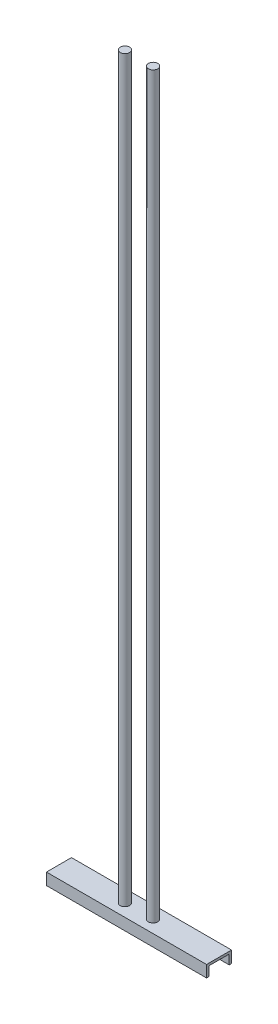
ISO-10303-21;
HEADER;
FILE_DESCRIPTION(('STEP AP214'),'2;1');
FILE_NAME('part.step','',(''),(''),'','','');
FILE_SCHEMA(('AUTOMOTIVE_DESIGN { 1 0 10303 214 1 1 1 1 }'));
ENDSEC;
DATA;
#1=APPLICATION_CONTEXT('core data for automotive mechanical design processes');
#2=APPLICATION_PROTOCOL_DEFINITION('international standard','automotive_design',2000,#1);
#3=PRODUCT_CONTEXT('',#1,'mechanical');
#4=PRODUCT('Part','Part','',(#3));
#5=PRODUCT_RELATED_PRODUCT_CATEGORY('part','',(#4));
#6=PRODUCT_DEFINITION_FORMATION('','',#4);
#7=PRODUCT_DEFINITION_CONTEXT('part definition',#1,'design');
#8=PRODUCT_DEFINITION('design','',#6,#7);
#9=PRODUCT_DEFINITION_SHAPE('','',#8);
#10=(LENGTH_UNIT() NAMED_UNIT(*) SI_UNIT(.MILLI.,.METRE.));
#11=(NAMED_UNIT(*) PLANE_ANGLE_UNIT() SI_UNIT($,.RADIAN.));
#12=(NAMED_UNIT(*) SI_UNIT($,.STERADIAN.) SOLID_ANGLE_UNIT());
#13=UNCERTAINTY_MEASURE_WITH_UNIT(LENGTH_MEASURE(1.E-05),#10,'distance_accuracy_value','');
#14=(GEOMETRIC_REPRESENTATION_CONTEXT(3) GLOBAL_UNCERTAINTY_ASSIGNED_CONTEXT((#13)) GLOBAL_UNIT_ASSIGNED_CONTEXT((#10,
#11,#12)) REPRESENTATION_CONTEXT('',''));
#15=CARTESIAN_POINT('',(0.,0.,0.));
#16=DIRECTION('',(0.,0.,1.));
#17=DIRECTION('',(1.,0.,0.));
#18=AXIS2_PLACEMENT_3D('',#15,#16,#17);
#19=CARTESIAN_POINT('',(0.,-9.525,0.));
#20=DIRECTION('',(0.,-1.,0.));
#21=DIRECTION('',(0.,0.,-1.));
#22=AXIS2_PLACEMENT_3D('',#19,#20,#21);
#23=PLANE('',#22);
#24=DIRECTION('',(0.,0.,1.));
#25=VECTOR('',#24,1.);
#26=CARTESIAN_POINT('',(-325.,-9.525,50.8));
#27=LINE('',#26,#25);
#28=CARTESIAN_POINT('',(-325.,-9.525,-36.2750000000001));
#29=VERTEX_POINT('',#28);
#30=CARTESIAN_POINT('',(-325.,-9.525,36.275));
#31=VERTEX_POINT('',#30);
#32=EDGE_CURVE('E163',#29,#31,#27,.T.);
#33=ORIENTED_EDGE('',*,*,#32,.F.);
#34=DIRECTION('',(-1.,0.,0.));
#35=VECTOR('',#34,1.);
#36=CARTESIAN_POINT('',(0.,-9.525,-36.275));
#37=LINE('',#36,#35);
#38=CARTESIAN_POINT('',(325.,-9.525,-36.275));
#39=VERTEX_POINT('',#38);
#40=EDGE_CURVE('E188',#29,#39,#37,.F.);
#41=ORIENTED_EDGE('',*,*,#40,.T.);
#42=DIRECTION('',(0.,0.,-1.));
#43=VECTOR('',#42,1.);
#44=CARTESIAN_POINT('',(325.,-9.525,50.8));
#45=LINE('',#44,#43);
#46=CARTESIAN_POINT('',(325.,-9.525,36.275));
#47=VERTEX_POINT('',#46);
#48=EDGE_CURVE('E161',#47,#39,#45,.T.);
#49=ORIENTED_EDGE('',*,*,#48,.F.);
#50=DIRECTION('',(1.,0.,0.));
#51=VECTOR('',#50,1.);
#52=CARTESIAN_POINT('',(0.,-9.525,36.275));
#53=LINE('',#52,#51);
#54=EDGE_CURVE('E186',#47,#31,#53,.F.);
#55=ORIENTED_EDGE('',*,*,#54,.T.);
#56=EDGE_LOOP('',(#33,#41,#49,#55));
#57=FACE_BOUND('',#56,.T.);
#58=ADVANCED_FACE('F32',(#57),#23,.T.);
#59=CARTESIAN_POINT('',(325.,-9.525,50.8));
#60=DIRECTION('',(1.,0.,0.));
#61=DIRECTION('',(0.,0.,-1.));
#62=AXIS2_PLACEMENT_3D('',#59,#60,#61);
#63=PLANE('',#62);
#64=DIRECTION('',(0.,0.,-1.));
#65=VECTOR('',#64,1.);
#66=CARTESIAN_POINT('',(325.,0.,50.8));
#67=LINE('',#66,#65);
#68=CARTESIAN_POINT('',(325.,0.,50.8));
#69=VERTEX_POINT('',#68);
#70=CARTESIAN_POINT('',(325.,0.,-50.8));
#71=VERTEX_POINT('',#70);
#72=EDGE_CURVE('E160',#69,#71,#67,.T.);
#73=ORIENTED_EDGE('',*,*,#72,.F.);
#74=DIRECTION('',(0.,1.,0.));
#75=VECTOR('',#74,1.);
#76=CARTESIAN_POINT('',(325.,-9.525,50.8));
#77=LINE('',#76,#75);
#78=CARTESIAN_POINT('',(325.,-47.625,50.8));
#79=VERTEX_POINT('',#78);
#80=EDGE_CURVE('E177',#79,#69,#77,.T.);
#81=ORIENTED_EDGE('',*,*,#80,.F.);
#82=DIRECTION('',(0.,0.,1.));
#83=VECTOR('',#82,1.);
#84=CARTESIAN_POINT('',(325.,-47.625,50.8));
#85=LINE('',#84,#83);
#86=CARTESIAN_POINT('',(325.,-47.625,41.275));
#87=VERTEX_POINT('',#86);
#88=EDGE_CURVE('E149',#87,#79,#85,.T.);
#89=ORIENTED_EDGE('',*,*,#88,.F.);
#90=DIRECTION('',(0.,1.,0.));
#91=VECTOR('',#90,1.);
#92=CARTESIAN_POINT('',(325.,-47.625,41.275));
#93=LINE('',#92,#91);
#94=CARTESIAN_POINT('',(325.,-14.525,41.275));
#95=VERTEX_POINT('',#94);
#96=EDGE_CURVE('E155',#87,#95,#93,.T.);
#97=ORIENTED_EDGE('',*,*,#96,.T.);
#98=CARTESIAN_POINT('',(325.,-14.525,36.275));
#99=DIRECTION('',(1.,0.,0.));
#100=DIRECTION('',(0.,0.,-1.));
#101=AXIS2_PLACEMENT_3D('',#98,#99,#100);
#102=CIRCLE('',#101,5.);
#103=EDGE_CURVE('E55',#95,#47,#102,.F.);
#104=ORIENTED_EDGE('',*,*,#103,.T.);
#105=ORIENTED_EDGE('',*,*,#48,.T.);
#106=CARTESIAN_POINT('',(325.,-14.525,-36.275));
#107=DIRECTION('',(1.,0.,0.));
#108=DIRECTION('',(0.,0.,-1.));
#109=AXIS2_PLACEMENT_3D('',#106,#107,#108);
#110=CIRCLE('',#109,5.);
#111=CARTESIAN_POINT('',(325.,-14.525,-41.275));
#112=VERTEX_POINT('',#111);
#113=EDGE_CURVE('E139',#39,#112,#110,.F.);
#114=ORIENTED_EDGE('',*,*,#113,.T.);
#115=DIRECTION('',(0.,1.,0.));
#116=VECTOR('',#115,1.);
#117=CARTESIAN_POINT('',(325.,-47.625,-41.275));
#118=LINE('',#117,#116);
#119=CARTESIAN_POINT('',(325.,-47.625,-41.275));
#120=VERTEX_POINT('',#119);
#121=EDGE_CURVE('E117',#120,#112,#118,.T.);
#122=ORIENTED_EDGE('',*,*,#121,.F.);
#123=DIRECTION('',(0.,0.,1.));
#124=VECTOR('',#123,1.);
#125=CARTESIAN_POINT('',(325.,-47.625,-50.8));
#126=LINE('',#125,#124);
#127=CARTESIAN_POINT('',(325.,-47.625,-50.8));
#128=VERTEX_POINT('',#127);
#129=EDGE_CURVE('E125',#128,#120,#126,.T.);
#130=ORIENTED_EDGE('',*,*,#129,.F.);
#131=DIRECTION('',(0.,1.,0.));
#132=VECTOR('',#131,1.);
#133=CARTESIAN_POINT('',(325.,-9.525,-50.8));
#134=LINE('',#133,#132);
#135=EDGE_CURVE('E166',#128,#71,#134,.T.);
#136=ORIENTED_EDGE('',*,*,#135,.T.);
#137=EDGE_LOOP('',(#73,#81,#89,#97,#104,#105,#114,#122,#130,#136));
#138=FACE_BOUND('',#137,.T.);
#139=ADVANCED_FACE('F136',(#138),#63,.T.);
#140=CARTESIAN_POINT('',(-325.,-9.525,50.8));
#141=DIRECTION('',(0.,0.,1.));
#142=DIRECTION('',(1.,0.,0.));
#143=AXIS2_PLACEMENT_3D('',#140,#141,#142);
#144=PLANE('',#143);
#145=DIRECTION('',(1.,0.,0.));
#146=VECTOR('',#145,1.);
#147=CARTESIAN_POINT('',(-325.,0.,50.8));
#148=LINE('',#147,#146);
#149=CARTESIAN_POINT('',(-325.,0.,50.8));
#150=VERTEX_POINT('',#149);
#151=EDGE_CURVE('E164',#150,#69,#148,.T.);
#152=ORIENTED_EDGE('',*,*,#151,.F.);
#153=DIRECTION('',(0.,1.,0.));
#154=VECTOR('',#153,1.);
#155=CARTESIAN_POINT('',(-325.,-9.525,50.8));
#156=LINE('',#155,#154);
#157=CARTESIAN_POINT('',(-325.,-47.625,50.8));
#158=VERTEX_POINT('',#157);
#159=EDGE_CURVE('E180',#158,#150,#156,.T.);
#160=ORIENTED_EDGE('',*,*,#159,.F.);
#161=DIRECTION('',(-1.,0.,0.));
#162=VECTOR('',#161,1.);
#163=CARTESIAN_POINT('',(-325.,-47.625,50.8));
#164=LINE('',#163,#162);
#165=EDGE_CURVE('E152',#79,#158,#164,.T.);
#166=ORIENTED_EDGE('',*,*,#165,.F.);
#167=ORIENTED_EDGE('',*,*,#80,.T.);
#168=EDGE_LOOP('',(#152,#160,#166,#167));
#169=FACE_BOUND('',#168,.T.);
#170=ADVANCED_FACE('F216',(#169),#144,.T.);
#171=CARTESIAN_POINT('',(-325.,-9.525,50.8));
#172=DIRECTION('',(-1.,0.,0.));
#173=DIRECTION('',(0.,0.,1.));
#174=AXIS2_PLACEMENT_3D('',#171,#172,#173);
#175=PLANE('',#174);
#176=DIRECTION('',(0.,0.,1.));
#177=VECTOR('',#176,1.);
#178=CARTESIAN_POINT('',(-325.,0.,50.8));
#179=LINE('',#178,#177);
#180=CARTESIAN_POINT('',(-325.,0.,-50.8));
#181=VERTEX_POINT('',#180);
#182=EDGE_CURVE('E172',#181,#150,#179,.T.);
#183=ORIENTED_EDGE('',*,*,#182,.F.);
#184=DIRECTION('',(0.,1.,0.));
#185=VECTOR('',#184,1.);
#186=CARTESIAN_POINT('',(-325.,-9.525,-50.8));
#187=LINE('',#186,#185);
#188=CARTESIAN_POINT('',(-325.,-47.625,-50.8000000000001));
#189=VERTEX_POINT('',#188);
#190=EDGE_CURVE('E182',#189,#181,#187,.T.);
#191=ORIENTED_EDGE('',*,*,#190,.F.);
#192=DIRECTION('',(0.,0.,-1.));
#193=VECTOR('',#192,1.);
#194=CARTESIAN_POINT('',(-325.,-47.625,-50.8000000000001));
#195=LINE('',#194,#193);
#196=CARTESIAN_POINT('',(-325.,-47.625,-41.2750000000001));
#197=VERTEX_POINT('',#196);
#198=EDGE_CURVE('E124',#197,#189,#195,.T.);
#199=ORIENTED_EDGE('',*,*,#198,.F.);
#200=DIRECTION('',(0.,1.,0.));
#201=VECTOR('',#200,1.);
#202=CARTESIAN_POINT('',(-325.,-47.625,-41.2750000000001));
#203=LINE('',#202,#201);
#204=CARTESIAN_POINT('',(-325.,-14.525,-41.2750000000001));
#205=VERTEX_POINT('',#204);
#206=EDGE_CURVE('E120',#197,#205,#203,.T.);
#207=ORIENTED_EDGE('',*,*,#206,.T.);
#208=CARTESIAN_POINT('',(-325.,-14.525,-36.2750000000001));
#209=DIRECTION('',(-1.,0.,0.));
#210=DIRECTION('',(0.,0.,1.));
#211=AXIS2_PLACEMENT_3D('',#208,#209,#210);
#212=CIRCLE('',#211,5.);
#213=EDGE_CURVE('E192',#205,#29,#212,.F.);
#214=ORIENTED_EDGE('',*,*,#213,.T.);
#215=ORIENTED_EDGE('',*,*,#32,.T.);
#216=CARTESIAN_POINT('',(-325.,-14.525,36.275));
#217=DIRECTION('',(-1.,0.,0.));
#218=DIRECTION('',(0.,0.,1.));
#219=AXIS2_PLACEMENT_3D('',#216,#217,#218);
#220=CIRCLE('',#219,5.);
#221=CARTESIAN_POINT('',(-325.,-14.525,41.275));
#222=VERTEX_POINT('',#221);
#223=EDGE_CURVE('E47',#31,#222,#220,.F.);
#224=ORIENTED_EDGE('',*,*,#223,.T.);
#225=DIRECTION('',(0.,1.,0.));
#226=VECTOR('',#225,1.);
#227=CARTESIAN_POINT('',(-325.,-47.625,41.275));
#228=LINE('',#227,#226);
#229=CARTESIAN_POINT('',(-325.,-47.625,41.275));
#230=VERTEX_POINT('',#229);
#231=EDGE_CURVE('E158',#230,#222,#228,.T.);
#232=ORIENTED_EDGE('',*,*,#231,.F.);
#233=DIRECTION('',(0.,0.,-1.));
#234=VECTOR('',#233,1.);
#235=CARTESIAN_POINT('',(-325.,-47.625,50.8));
#236=LINE('',#235,#234);
#237=EDGE_CURVE('E140',#158,#230,#236,.T.);
#238=ORIENTED_EDGE('',*,*,#237,.F.);
#239=ORIENTED_EDGE('',*,*,#159,.T.);
#240=EDGE_LOOP('',(#183,#191,#199,#207,#214,#215,#224,#232,#238,#239));
#241=FACE_BOUND('',#240,.T.);
#242=ADVANCED_FACE('F213',(#241),#175,.T.);
#243=CARTESIAN_POINT('',(-325.,-9.525,-50.8));
#244=DIRECTION('',(0.,0.,-1.));
#245=DIRECTION('',(-1.,0.,0.));
#246=AXIS2_PLACEMENT_3D('',#243,#244,#245);
#247=PLANE('',#246);
#248=DIRECTION('',(-1.,0.,0.));
#249=VECTOR('',#248,1.);
#250=CARTESIAN_POINT('',(-325.,0.,-50.8));
#251=LINE('',#250,#249);
#252=EDGE_CURVE('E169',#71,#181,#251,.T.);
#253=ORIENTED_EDGE('',*,*,#252,.F.);
#254=ORIENTED_EDGE('',*,*,#135,.F.);
#255=DIRECTION('',(1.,0.,0.));
#256=VECTOR('',#255,1.);
#257=CARTESIAN_POINT('',(325.,-47.625,-50.8));
#258=LINE('',#257,#256);
#259=EDGE_CURVE('E131',#189,#128,#258,.T.);
#260=ORIENTED_EDGE('',*,*,#259,.F.);
#261=ORIENTED_EDGE('',*,*,#190,.T.);
#262=EDGE_LOOP('',(#253,#254,#260,#261));
#263=FACE_BOUND('',#262,.T.);
#264=ADVANCED_FACE('F205',(#263),#247,.T.);
#265=CARTESIAN_POINT('',(0.,0.,0.));
#266=DIRECTION('',(0.,-1.,0.));
#267=DIRECTION('',(0.,0.,-1.));
#268=AXIS2_PLACEMENT_3D('',#265,#266,#267);
#269=PLANE('',#268);
#270=CARTESIAN_POINT('',(57.15,0.,1.31898946727457E-13));
#271=DIRECTION('',(0.,-1.,0.));
#272=DIRECTION('',(0.,0.,-1.));
#273=AXIS2_PLACEMENT_3D('',#270,#271,#272);
#274=CIRCLE('',#273,19.05);
#275=CARTESIAN_POINT('',(57.15,0.,-19.0499999999999));
#276=VERTEX_POINT('',#275);
#277=EDGE_CURVE('E11',#276,#276,#274,.F.);
#278=ORIENTED_EDGE('',*,*,#277,.F.);
#279=EDGE_LOOP('',(#278));
#280=FACE_BOUND('',#279,.T.);
#281=CARTESIAN_POINT('',(-57.15,0.,0.));
#282=DIRECTION('',(0.,-1.,0.));
#283=DIRECTION('',(0.,0.,-1.));
#284=AXIS2_PLACEMENT_3D('',#281,#282,#283);
#285=CIRCLE('',#284,19.05);
#286=CARTESIAN_POINT('',(-57.15,0.,-19.05));
#287=VERTEX_POINT('',#286);
#288=EDGE_CURVE('E40',#287,#287,#285,.F.);
#289=ORIENTED_EDGE('',*,*,#288,.F.);
#290=EDGE_LOOP('',(#289));
#291=FACE_BOUND('',#290,.T.);
#292=ORIENTED_EDGE('',*,*,#72,.T.);
#293=ORIENTED_EDGE('',*,*,#252,.T.);
#294=ORIENTED_EDGE('',*,*,#182,.T.);
#295=ORIENTED_EDGE('',*,*,#151,.T.);
#296=EDGE_LOOP('',(#292,#293,#294,#295));
#297=FACE_BOUND('',#296,.T.);
#298=ADVANCED_FACE('F201',(#280,#291,#297),#269,.F.);
#299=CARTESIAN_POINT('',(-325.,-47.625,41.275));
#300=DIRECTION('',(0.,0.,1.));
#301=DIRECTION('',(1.,0.,0.));
#302=AXIS2_PLACEMENT_3D('',#299,#300,#301);
#303=PLANE('',#302);
#304=ORIENTED_EDGE('',*,*,#231,.T.);
#305=DIRECTION('',(1.,0.,0.));
#306=VECTOR('',#305,1.);
#307=CARTESIAN_POINT('',(-325.,-14.525,41.275));
#308=LINE('',#307,#306);
#309=EDGE_CURVE('E190',#222,#95,#308,.T.);
#310=ORIENTED_EDGE('',*,*,#309,.T.);
#311=ORIENTED_EDGE('',*,*,#96,.F.);
#312=DIRECTION('',(1.,0.,0.));
#313=VECTOR('',#312,1.);
#314=CARTESIAN_POINT('',(-325.,-47.625,41.275));
#315=LINE('',#314,#313);
#316=EDGE_CURVE('E143',#230,#87,#315,.T.);
#317=ORIENTED_EDGE('',*,*,#316,.F.);
#318=EDGE_LOOP('',(#304,#310,#311,#317));
#319=FACE_BOUND('',#318,.T.);
#320=ADVANCED_FACE('F204',(#319),#303,.F.);
#321=CARTESIAN_POINT('',(0.,-47.625,0.));
#322=DIRECTION('',(0.,-1.,0.));
#323=DIRECTION('',(0.,0.,-1.));
#324=AXIS2_PLACEMENT_3D('',#321,#322,#323);
#325=PLANE('',#324);
#326=ORIENTED_EDGE('',*,*,#237,.T.);
#327=ORIENTED_EDGE('',*,*,#316,.T.);
#328=ORIENTED_EDGE('',*,*,#88,.T.);
#329=ORIENTED_EDGE('',*,*,#165,.T.);
#330=EDGE_LOOP('',(#326,#327,#328,#329));
#331=FACE_BOUND('',#330,.T.);
#332=ADVANCED_FACE('F219',(#331),#325,.T.);
#333=CARTESIAN_POINT('',(325.,-47.625,-41.275));
#334=DIRECTION('',(0.,0.,-1.));
#335=DIRECTION('',(-1.,0.,0.));
#336=AXIS2_PLACEMENT_3D('',#333,#334,#335);
#337=PLANE('',#336);
#338=ORIENTED_EDGE('',*,*,#121,.T.);
#339=DIRECTION('',(-1.,0.,0.));
#340=VECTOR('',#339,1.);
#341=CARTESIAN_POINT('',(325.,-14.525,-41.275));
#342=LINE('',#341,#340);
#343=EDGE_CURVE('E179',#112,#205,#342,.T.);
#344=ORIENTED_EDGE('',*,*,#343,.T.);
#345=ORIENTED_EDGE('',*,*,#206,.F.);
#346=DIRECTION('',(-1.,0.,0.));
#347=VECTOR('',#346,1.);
#348=CARTESIAN_POINT('',(325.,-47.625,-41.275));
#349=LINE('',#348,#347);
#350=EDGE_CURVE('E112',#120,#197,#349,.T.);
#351=ORIENTED_EDGE('',*,*,#350,.F.);
#352=EDGE_LOOP('',(#338,#344,#345,#351));
#353=FACE_BOUND('',#352,.T.);
#354=ADVANCED_FACE('F114',(#353),#337,.F.);
#355=CARTESIAN_POINT('',(0.,-47.625,0.));
#356=DIRECTION('',(0.,-1.,0.));
#357=DIRECTION('',(0.,0.,-1.));
#358=AXIS2_PLACEMENT_3D('',#355,#356,#357);
#359=PLANE('',#358);
#360=ORIENTED_EDGE('',*,*,#129,.T.);
#361=ORIENTED_EDGE('',*,*,#350,.T.);
#362=ORIENTED_EDGE('',*,*,#198,.T.);
#363=ORIENTED_EDGE('',*,*,#259,.T.);
#364=EDGE_LOOP('',(#360,#361,#362,#363));
#365=FACE_BOUND('',#364,.T.);
#366=ADVANCED_FACE('F129',(#365),#359,.T.);
#367=CARTESIAN_POINT('',(325.,-14.525,-36.275));
#368=DIRECTION('',(-1.,0.,0.));
#369=DIRECTION('',(0.,0.,1.));
#370=AXIS2_PLACEMENT_3D('',#367,#368,#369);
#371=CYLINDRICAL_SURFACE('',#370,5.);
#372=ORIENTED_EDGE('',*,*,#113,.F.);
#373=ORIENTED_EDGE('',*,*,#40,.F.);
#374=ORIENTED_EDGE('',*,*,#213,.F.);
#375=ORIENTED_EDGE('',*,*,#343,.F.);
#376=EDGE_LOOP('',(#372,#373,#374,#375));
#377=FACE_BOUND('',#376,.T.);
#378=ADVANCED_FACE('F227',(#377),#371,.F.);
#379=CARTESIAN_POINT('',(-325.,-14.525,36.275));
#380=DIRECTION('',(1.,0.,0.));
#381=DIRECTION('',(0.,0.,-1.));
#382=AXIS2_PLACEMENT_3D('',#379,#380,#381);
#383=CYLINDRICAL_SURFACE('',#382,5.);
#384=ORIENTED_EDGE('',*,*,#223,.F.);
#385=ORIENTED_EDGE('',*,*,#54,.F.);
#386=ORIENTED_EDGE('',*,*,#103,.F.);
#387=ORIENTED_EDGE('',*,*,#309,.F.);
#388=EDGE_LOOP('',(#384,#385,#386,#387));
#389=FACE_BOUND('',#388,.T.);
#390=ADVANCED_FACE('F34',(#389),#383,.F.);
#391=CARTESIAN_POINT('',(-57.15,3000.,0.));
#392=DIRECTION('',(0.,-1.,0.));
#393=DIRECTION('',(0.,0.,-1.));
#394=AXIS2_PLACEMENT_3D('',#391,#392,#393);
#395=CYLINDRICAL_SURFACE('',#394,19.05);
#396=CARTESIAN_POINT('',(-57.15,3000.,0.));
#397=DIRECTION('',(0.,1.,0.));
#398=DIRECTION('',(0.,0.,1.));
#399=AXIS2_PLACEMENT_3D('',#396,#397,#398);
#400=CIRCLE('',#399,19.05);
#401=CARTESIAN_POINT('',(-57.15,3000.,19.05));
#402=VERTEX_POINT('',#401);
#403=EDGE_CURVE('E133',#402,#402,#400,.T.);
#404=ORIENTED_EDGE('',*,*,#403,.F.);
#405=EDGE_LOOP('',(#404));
#406=FACE_BOUND('',#405,.T.);
#407=ORIENTED_EDGE('',*,*,#288,.T.);
#408=EDGE_LOOP('',(#407));
#409=FACE_BOUND('',#408,.T.);
#410=ADVANCED_FACE('F199',(#406,#409),#395,.T.);
#411=CARTESIAN_POINT('',(-57.15,3000.,0.));
#412=DIRECTION('',(0.,1.,0.));
#413=DIRECTION('',(0.,0.,1.));
#414=AXIS2_PLACEMENT_3D('',#411,#412,#413);
#415=PLANE('',#414);
#416=ORIENTED_EDGE('',*,*,#403,.T.);
#417=EDGE_LOOP('',(#416));
#418=FACE_BOUND('',#417,.T.);
#419=ADVANCED_FACE('F343',(#418),#415,.T.);
#420=CARTESIAN_POINT('',(57.15,3000.,1.31898946727457E-13));
#421=DIRECTION('',(0.,-1.,0.));
#422=DIRECTION('',(0.,0.,-1.));
#423=AXIS2_PLACEMENT_3D('',#420,#421,#422);
#424=CYLINDRICAL_SURFACE('',#423,19.05);
#425=CARTESIAN_POINT('',(57.15,3000.,1.31898946727457E-13));
#426=DIRECTION('',(0.,1.,0.));
#427=DIRECTION('',(0.,0.,-1.));
#428=AXIS2_PLACEMENT_3D('',#425,#426,#427);
#429=CIRCLE('',#428,19.05);
#430=CARTESIAN_POINT('',(57.15,3000.,-19.0499999999999));
#431=VERTEX_POINT('',#430);
#432=EDGE_CURVE('E379',#431,#431,#429,.T.);
#433=ORIENTED_EDGE('',*,*,#432,.F.);
#434=EDGE_LOOP('',(#433));
#435=FACE_BOUND('',#434,.T.);
#436=ORIENTED_EDGE('',*,*,#277,.T.);
#437=EDGE_LOOP('',(#436));
#438=FACE_BOUND('',#437,.T.);
#439=ADVANCED_FACE('F352',(#435,#438),#424,.T.);
#440=CARTESIAN_POINT('',(57.15,3000.,1.31898946727457E-13));
#441=DIRECTION('',(0.,-1.,0.));
#442=DIRECTION('',(0.,0.,-1.));
#443=AXIS2_PLACEMENT_3D('',#440,#441,#442);
#444=PLANE('',#443);
#445=ORIENTED_EDGE('',*,*,#432,.T.);
#446=EDGE_LOOP('',(#445));
#447=FACE_BOUND('',#446,.T.);
#448=ADVANCED_FACE('F361',(#447),#444,.F.);
#449=CLOSED_SHELL('',(#58,#139,#170,#242,#264,#298,#320,#332,#354,#366,#378,#390,#410,#419,#439,#448));
#450=MANIFOLD_SOLID_BREP('B2',#449);
#451=ADVANCED_BREP_SHAPE_REPRESENTATION('',(#18,#450),#14);
#452=SHAPE_DEFINITION_REPRESENTATION(#9,#451);
ENDSEC;
END-ISO-10303-21;
